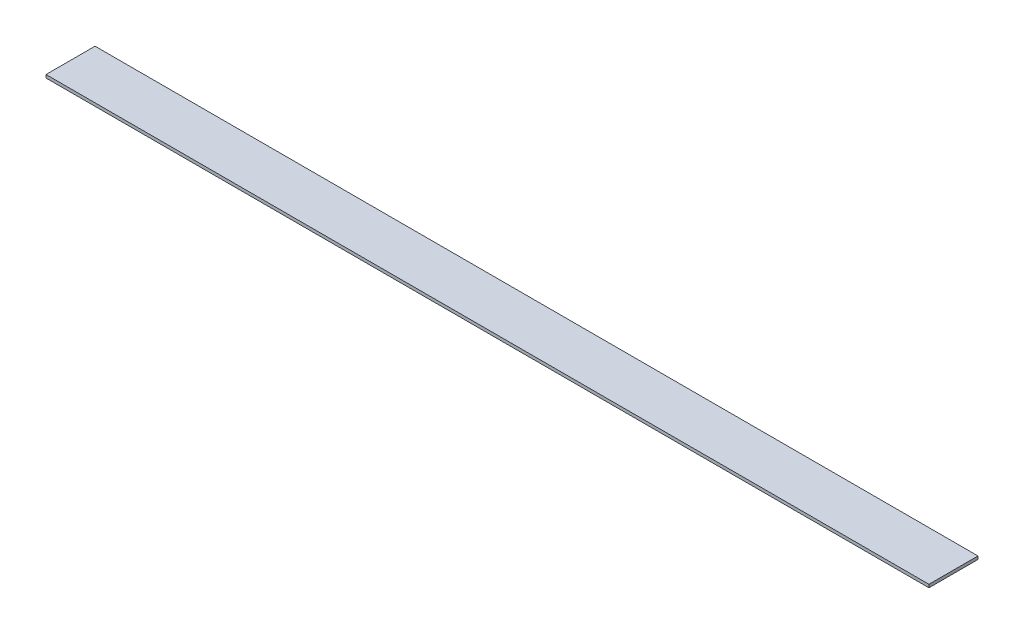
ISO-10303-21;
HEADER;
FILE_DESCRIPTION(('STEP AP214'),'2;1');
FILE_NAME('part.step','',(''),(''),'','','');
FILE_SCHEMA(('AUTOMOTIVE_DESIGN { 1 0 10303 214 1 1 1 1 }'));
ENDSEC;
DATA;
#1=APPLICATION_CONTEXT('core data for automotive mechanical design processes');
#2=APPLICATION_PROTOCOL_DEFINITION('international standard','automotive_design',2000,#1);
#3=PRODUCT_CONTEXT('',#1,'mechanical');
#4=PRODUCT('Part','Part','',(#3));
#5=PRODUCT_RELATED_PRODUCT_CATEGORY('part','',(#4));
#6=PRODUCT_DEFINITION_FORMATION('','',#4);
#7=PRODUCT_DEFINITION_CONTEXT('part definition',#1,'design');
#8=PRODUCT_DEFINITION('design','',#6,#7);
#9=PRODUCT_DEFINITION_SHAPE('','',#8);
#10=(LENGTH_UNIT() NAMED_UNIT(*) SI_UNIT(.MILLI.,.METRE.));
#11=(NAMED_UNIT(*) PLANE_ANGLE_UNIT() SI_UNIT($,.RADIAN.));
#12=(NAMED_UNIT(*) SI_UNIT($,.STERADIAN.) SOLID_ANGLE_UNIT());
#13=UNCERTAINTY_MEASURE_WITH_UNIT(LENGTH_MEASURE(1.E-05),#10,'distance_accuracy_value','');
#14=(GEOMETRIC_REPRESENTATION_CONTEXT(3) GLOBAL_UNCERTAINTY_ASSIGNED_CONTEXT((#13)) GLOBAL_UNIT_ASSIGNED_CONTEXT((#10,
#11,#12)) REPRESENTATION_CONTEXT('',''));
#15=CARTESIAN_POINT('',(0.,0.,0.));
#16=DIRECTION('',(0.,0.,1.));
#17=DIRECTION('',(1.,0.,0.));
#18=AXIS2_PLACEMENT_3D('',#15,#16,#17);
#19=CARTESIAN_POINT('',(457.2,3.175,25.4));
#20=DIRECTION('',(-1.,0.,0.));
#21=DIRECTION('',(0.,0.,1.));
#22=AXIS2_PLACEMENT_3D('',#19,#20,#21);
#23=PLANE('',#22);
#24=DIRECTION('',(0.,0.,-1.));
#25=VECTOR('',#24,1.);
#26=CARTESIAN_POINT('',(457.2,0.,25.4));
#27=LINE('',#26,#25);
#28=CARTESIAN_POINT('',(457.2,0.,25.4));
#29=VERTEX_POINT('',#28);
#30=CARTESIAN_POINT('',(457.2,0.,-25.4));
#31=VERTEX_POINT('',#30);
#32=EDGE_CURVE('E119',#29,#31,#27,.T.);
#33=ORIENTED_EDGE('',*,*,#32,.T.);
#34=DIRECTION('',(0.,-1.,0.));
#35=VECTOR('',#34,1.);
#36=CARTESIAN_POINT('',(457.2,3.175,-25.4));
#37=LINE('',#36,#35);
#38=CARTESIAN_POINT('',(457.2,3.175,-25.4));
#39=VERTEX_POINT('',#38);
#40=EDGE_CURVE('E11',#39,#31,#37,.T.);
#41=ORIENTED_EDGE('',*,*,#40,.F.);
#42=DIRECTION('',(0.,0.,-1.));
#43=VECTOR('',#42,1.);
#44=CARTESIAN_POINT('',(457.2,3.175,25.4));
#45=LINE('',#44,#43);
#46=CARTESIAN_POINT('',(457.2,3.175,25.4));
#47=VERTEX_POINT('',#46);
#48=EDGE_CURVE('E102',#47,#39,#45,.T.);
#49=ORIENTED_EDGE('',*,*,#48,.F.);
#50=DIRECTION('',(0.,-1.,0.));
#51=VECTOR('',#50,1.);
#52=CARTESIAN_POINT('',(457.2,3.175,25.4));
#53=LINE('',#52,#51);
#54=EDGE_CURVE('E115',#47,#29,#53,.T.);
#55=ORIENTED_EDGE('',*,*,#54,.T.);
#56=EDGE_LOOP('',(#33,#41,#49,#55));
#57=FACE_BOUND('',#56,.T.);
#58=ADVANCED_FACE('F46',(#57),#23,.F.);
#59=CARTESIAN_POINT('',(-457.2,3.175,-25.4));
#60=DIRECTION('',(0.,0.,1.));
#61=DIRECTION('',(1.,0.,0.));
#62=AXIS2_PLACEMENT_3D('',#59,#60,#61);
#63=PLANE('',#62);
#64=DIRECTION('',(-1.,0.,0.));
#65=VECTOR('',#64,1.);
#66=CARTESIAN_POINT('',(-457.2,0.,-25.4));
#67=LINE('',#66,#65);
#68=CARTESIAN_POINT('',(-457.2,0.,-25.4));
#69=VERTEX_POINT('',#68);
#70=EDGE_CURVE('E107',#31,#69,#67,.T.);
#71=ORIENTED_EDGE('',*,*,#70,.T.);
#72=DIRECTION('',(0.,-1.,0.));
#73=VECTOR('',#72,1.);
#74=CARTESIAN_POINT('',(-457.2,3.175,-25.4));
#75=LINE('',#74,#73);
#76=CARTESIAN_POINT('',(-457.2,3.175,-25.4));
#77=VERTEX_POINT('',#76);
#78=EDGE_CURVE('E55',#77,#69,#75,.T.);
#79=ORIENTED_EDGE('',*,*,#78,.F.);
#80=DIRECTION('',(-1.,0.,0.));
#81=VECTOR('',#80,1.);
#82=CARTESIAN_POINT('',(-457.2,3.175,-25.4));
#83=LINE('',#82,#81);
#84=EDGE_CURVE('E97',#39,#77,#83,.T.);
#85=ORIENTED_EDGE('',*,*,#84,.F.);
#86=ORIENTED_EDGE('',*,*,#40,.T.);
#87=EDGE_LOOP('',(#71,#79,#85,#86));
#88=FACE_BOUND('',#87,.T.);
#89=ADVANCED_FACE('F106',(#88),#63,.F.);
#90=CARTESIAN_POINT('',(-457.2,3.175,25.4));
#91=DIRECTION('',(1.,0.,0.));
#92=DIRECTION('',(0.,0.,-1.));
#93=AXIS2_PLACEMENT_3D('',#90,#91,#92);
#94=PLANE('',#93);
#95=DIRECTION('',(0.,0.,1.));
#96=VECTOR('',#95,1.);
#97=CARTESIAN_POINT('',(-457.2,0.,25.4));
#98=LINE('',#97,#96);
#99=CARTESIAN_POINT('',(-457.2,0.,25.4));
#100=VERTEX_POINT('',#99);
#101=EDGE_CURVE('E84',#69,#100,#98,.T.);
#102=ORIENTED_EDGE('',*,*,#101,.T.);
#103=DIRECTION('',(0.,-1.,0.));
#104=VECTOR('',#103,1.);
#105=CARTESIAN_POINT('',(-457.2,3.175,25.4));
#106=LINE('',#105,#104);
#107=CARTESIAN_POINT('',(-457.2,3.175,25.4));
#108=VERTEX_POINT('',#107);
#109=EDGE_CURVE('E109',#108,#100,#106,.T.);
#110=ORIENTED_EDGE('',*,*,#109,.F.);
#111=DIRECTION('',(0.,0.,1.));
#112=VECTOR('',#111,1.);
#113=CARTESIAN_POINT('',(-457.2,3.175,25.4));
#114=LINE('',#113,#112);
#115=EDGE_CURVE('E100',#77,#108,#114,.T.);
#116=ORIENTED_EDGE('',*,*,#115,.F.);
#117=ORIENTED_EDGE('',*,*,#78,.T.);
#118=EDGE_LOOP('',(#102,#110,#116,#117));
#119=FACE_BOUND('',#118,.T.);
#120=ADVANCED_FACE('F110',(#119),#94,.F.);
#121=CARTESIAN_POINT('',(-457.2,3.175,25.4));
#122=DIRECTION('',(0.,0.,-1.));
#123=DIRECTION('',(-1.,0.,0.));
#124=AXIS2_PLACEMENT_3D('',#121,#122,#123);
#125=PLANE('',#124);
#126=DIRECTION('',(1.,0.,0.));
#127=VECTOR('',#126,1.);
#128=CARTESIAN_POINT('',(-457.2,0.,25.4));
#129=LINE('',#128,#127);
#130=EDGE_CURVE('E90',#100,#29,#129,.T.);
#131=ORIENTED_EDGE('',*,*,#130,.T.);
#132=ORIENTED_EDGE('',*,*,#54,.F.);
#133=DIRECTION('',(1.,0.,0.));
#134=VECTOR('',#133,1.);
#135=CARTESIAN_POINT('',(-457.2,3.175,25.4));
#136=LINE('',#135,#134);
#137=EDGE_CURVE('E63',#108,#47,#136,.T.);
#138=ORIENTED_EDGE('',*,*,#137,.F.);
#139=ORIENTED_EDGE('',*,*,#109,.T.);
#140=EDGE_LOOP('',(#131,#132,#138,#139));
#141=FACE_BOUND('',#140,.T.);
#142=ADVANCED_FACE('F131',(#141),#125,.F.);
#143=CARTESIAN_POINT('',(0.,3.175,0.));
#144=DIRECTION('',(0.,-1.,0.));
#145=DIRECTION('',(0.,0.,-1.));
#146=AXIS2_PLACEMENT_3D('',#143,#144,#145);
#147=PLANE('',#146);
#148=ORIENTED_EDGE('',*,*,#48,.T.);
#149=ORIENTED_EDGE('',*,*,#84,.T.);
#150=ORIENTED_EDGE('',*,*,#115,.T.);
#151=ORIENTED_EDGE('',*,*,#137,.T.);
#152=EDGE_LOOP('',(#148,#149,#150,#151));
#153=FACE_BOUND('',#152,.T.);
#154=ADVANCED_FACE('F98',(#153),#147,.F.);
#155=CARTESIAN_POINT('',(0.,0.,0.));
#156=DIRECTION('',(0.,-1.,0.));
#157=DIRECTION('',(0.,0.,-1.));
#158=AXIS2_PLACEMENT_3D('',#155,#156,#157);
#159=PLANE('',#158);
#160=ORIENTED_EDGE('',*,*,#32,.F.);
#161=ORIENTED_EDGE('',*,*,#130,.F.);
#162=ORIENTED_EDGE('',*,*,#101,.F.);
#163=ORIENTED_EDGE('',*,*,#70,.F.);
#164=EDGE_LOOP('',(#160,#161,#162,#163));
#165=FACE_BOUND('',#164,.T.);
#166=ADVANCED_FACE('F134',(#165),#159,.T.);
#167=CLOSED_SHELL('',(#58,#89,#120,#142,#154,#166));
#168=MANIFOLD_SOLID_BREP('B2',#167);
#169=ADVANCED_BREP_SHAPE_REPRESENTATION('',(#18,#168),#14);
#170=SHAPE_DEFINITION_REPRESENTATION(#9,#169);
ENDSEC;
END-ISO-10303-21;
